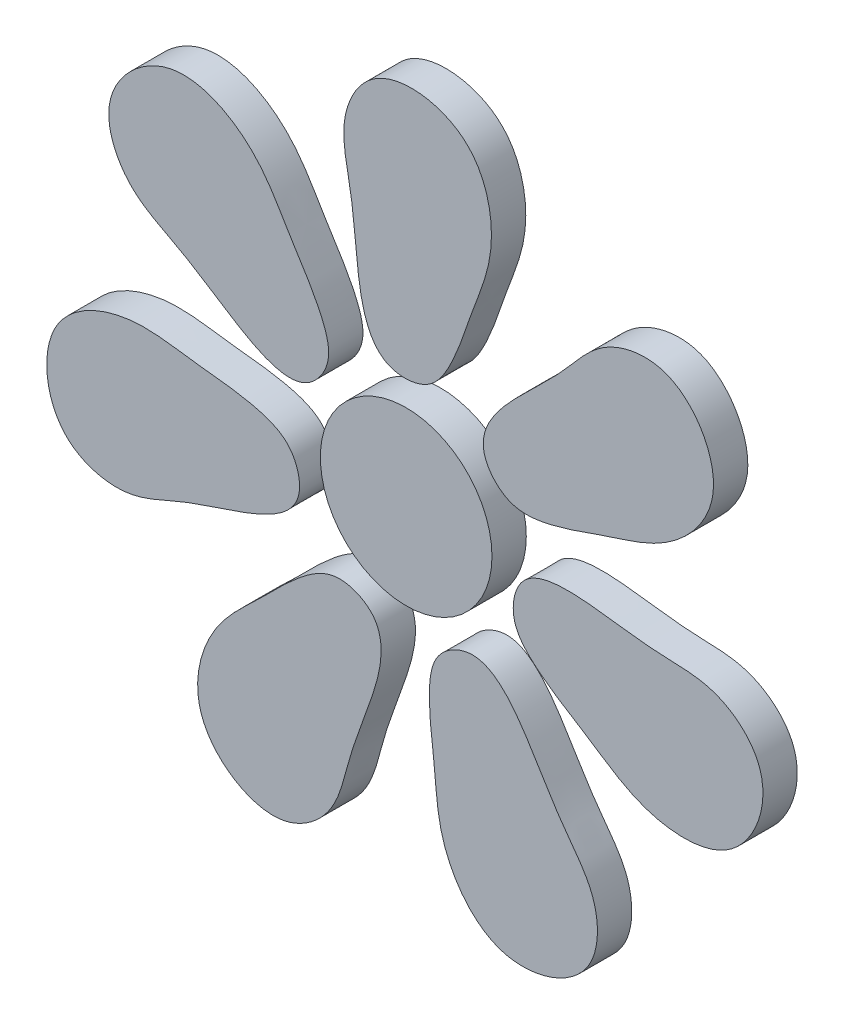
ISO-10303-21;
HEADER;
FILE_DESCRIPTION(('STEP AP214'),'2;1');
FILE_NAME('part.step','',(''),(''),'','','');
FILE_SCHEMA(('AUTOMOTIVE_DESIGN { 1 0 10303 214 1 1 1 1 }'));
ENDSEC;
DATA;
#1=APPLICATION_CONTEXT('core data for automotive mechanical design processes');
#2=APPLICATION_PROTOCOL_DEFINITION('international standard','automotive_design',2000,#1);
#3=PRODUCT_CONTEXT('',#1,'mechanical');
#4=PRODUCT('Part','Part','',(#3));
#5=PRODUCT_RELATED_PRODUCT_CATEGORY('part','',(#4));
#6=PRODUCT_DEFINITION_FORMATION('','',#4);
#7=PRODUCT_DEFINITION_CONTEXT('part definition',#1,'design');
#8=PRODUCT_DEFINITION('design','',#6,#7);
#9=PRODUCT_DEFINITION_SHAPE('','',#8);
#10=(LENGTH_UNIT() NAMED_UNIT(*) SI_UNIT(.MILLI.,.METRE.));
#11=(NAMED_UNIT(*) PLANE_ANGLE_UNIT() SI_UNIT($,.RADIAN.));
#12=(NAMED_UNIT(*) SI_UNIT($,.STERADIAN.) SOLID_ANGLE_UNIT());
#13=UNCERTAINTY_MEASURE_WITH_UNIT(LENGTH_MEASURE(1.E-05),#10,'distance_accuracy_value','');
#14=(GEOMETRIC_REPRESENTATION_CONTEXT(3) GLOBAL_UNCERTAINTY_ASSIGNED_CONTEXT((#13)) GLOBAL_UNIT_ASSIGNED_CONTEXT((#10,
#11,#12)) REPRESENTATION_CONTEXT('',''));
#15=CARTESIAN_POINT('',(0.,0.,0.));
#16=DIRECTION('',(0.,0.,1.));
#17=DIRECTION('',(1.,0.,0.));
#18=AXIS2_PLACEMENT_3D('',#15,#16,#17);
#19=CARTESIAN_POINT('',(-8.7157063745227,5.02927012028913,3.));
#20=CARTESIAN_POINT('',(-7.79480794176797,5.5258330694879,3.));
#21=CARTESIAN_POINT('',(-6.2833878442356,7.61822712008409,3.));
#22=CARTESIAN_POINT('',(-7.60543582917612,11.6263656182706,3.));
#23=CARTESIAN_POINT('',(-10.2531742253614,15.386270040157,3.));
#24=CARTESIAN_POINT('',(-13.1647376687376,20.885887549513,3.));
#25=CARTESIAN_POINT('',(-20.590599480846,24.84118901206,3.));
#26=CARTESIAN_POINT('',(-27.4268549689133,18.208794031494,3.));
#27=CARTESIAN_POINT('',(-24.5361890437206,11.8167667174271,3.));
#28=CARTESIAN_POINT('',(-19.5227764488252,9.61121625946348,3.));
#29=CARTESIAN_POINT('',(-15.2320361096864,6.55612792519539,3.));
#30=CARTESIAN_POINT('',(-10.5905530088203,4.01832326566444,3.));
#31=CARTESIAN_POINT('',(-8.7157063745227,5.02927012028913,3.));
#32=B_SPLINE_CURVE_WITH_KNOTS('',3,(#19,#20,#21,#22,#23,#24,#25,#26,#27,#28,#29,#30,#31),
.UNSPECIFIED.,.T.,.F.,(4,1,1,1,1,1,1,1,1,1,4),(0.,0.0586578101997314,0.114805371491496,
0.215050381526488,0.30976305051608,0.453162260181844,0.593196020306963,0.693192739936584,
0.777486537646103,0.8805792320666,1.),.UNSPECIFIED.);
#33=DIRECTION('',(0.,0.,-1.));
#34=VECTOR('',#33,1.);
#35=SURFACE_OF_LINEAR_EXTRUSION('',#32,#34);
#36=CARTESIAN_POINT('',(-8.7157063745227,5.02927012028913,3.));
#37=VERTEX_POINT('',#36);
#38=EDGE_CURVE('E11',#37,#37,#32,.T.);
#39=ORIENTED_EDGE('',*,*,#38,.F.);
#40=EDGE_LOOP('',(#39));
#41=FACE_BOUND('',#40,.T.);
#42=CARTESIAN_POINT('',(-8.7157063745227,5.02927012028913,0.));
#43=CARTESIAN_POINT('',(-7.79480794176797,5.5258330694879,0.));
#44=CARTESIAN_POINT('',(-6.2833878442356,7.61822712008409,0.));
#45=CARTESIAN_POINT('',(-7.60543582917612,11.6263656182706,0.));
#46=CARTESIAN_POINT('',(-10.2531742253614,15.386270040157,0.));
#47=CARTESIAN_POINT('',(-13.1647376687376,20.885887549513,0.));
#48=CARTESIAN_POINT('',(-20.590599480846,24.84118901206,0.));
#49=CARTESIAN_POINT('',(-27.4268549689133,18.208794031494,0.));
#50=CARTESIAN_POINT('',(-24.5361890437206,11.8167667174271,0.));
#51=CARTESIAN_POINT('',(-19.5227764488252,9.61121625946348,0.));
#52=CARTESIAN_POINT('',(-15.2320361096864,6.55612792519539,0.));
#53=CARTESIAN_POINT('',(-10.5905530088203,4.01832326566444,0.));
#54=CARTESIAN_POINT('',(-8.7157063745227,5.02927012028913,0.));
#55=B_SPLINE_CURVE_WITH_KNOTS('',3,(#42,#43,#44,#45,#46,#47,#48,#49,#50,#51,#52,#53,#54),
.UNSPECIFIED.,.T.,.F.,(4,1,1,1,1,1,1,1,1,1,4),(0.,0.0586578101997314,0.114805371491496,
0.215050381526488,0.30976305051608,0.453162260181844,0.593196020306963,0.693192739936584,
0.777486537646103,0.8805792320666,1.),.UNSPECIFIED.);
#56=CARTESIAN_POINT('',(-8.7157063745227,5.02927012028913,0.));
#57=VERTEX_POINT('',#56);
#58=EDGE_CURVE('E44',#57,#57,#55,.T.);
#59=ORIENTED_EDGE('',*,*,#58,.T.);
#60=EDGE_LOOP('',(#59));
#61=FACE_BOUND('',#60,.T.);
#62=ADVANCED_FACE('F40',(#41,#61),#35,.F.);
#63=CARTESIAN_POINT('',(-23.0372158571724,21.7789787478215,3.));
#64=DIRECTION('',(0.,0.,1.));
#65=DIRECTION('',(1.,0.,0.));
#66=AXIS2_PLACEMENT_3D('',#63,#64,#65);
#67=PLANE('',#66);
#68=ORIENTED_EDGE('',*,*,#38,.T.);
#69=EDGE_LOOP('',(#68));
#70=FACE_BOUND('',#69,.T.);
#71=ADVANCED_FACE('F63',(#70),#67,.T.);
#72=CARTESIAN_POINT('',(-23.0372158571724,21.7789787478215,0.));
#73=DIRECTION('',(0.,0.,1.));
#74=DIRECTION('',(1.,0.,0.));
#75=AXIS2_PLACEMENT_3D('',#72,#73,#74);
#76=PLANE('',#75);
#77=ORIENTED_EDGE('',*,*,#58,.F.);
#78=EDGE_LOOP('',(#77));
#79=FACE_BOUND('',#78,.T.);
#80=ADVANCED_FACE('F61',(#79),#76,.F.);
#81=CLOSED_SHELL('',(#62,#71,#80));
#82=MANIFOLD_SOLID_BREP('B2',#81);
#83=CARTESIAN_POINT('',(-9.36619575438787,-3.67851500475604,3.));
#84=CARTESIAN_POINT('',(-9.18025351972838,-2.6489256830666,3.));
#85=CARTESIAN_POINT('',(-9.87379804507752,-0.162663515564284,3.));
#86=CARTESIAN_POINT('',(-13.8317703452302,1.30275122653245,3.));
#87=CARTESIAN_POINT('',(-18.422219881343,1.57692805406512,3.));
#88=CARTESIAN_POINT('',(-24.5373241060997,2.72953152203774,3.));
#89=CARTESIAN_POINT('',(-32.2596524220326,-0.61015090195068,3.));
#90=CARTESIAN_POINT('',(-31.3365728017739,-10.0901812969986,3.));
#91=CARTESIAN_POINT('',(-24.5367838859027,-11.8155315149084,3.));
#92=CARTESIAN_POINT('',(-19.6866034762675,-9.27102593164264,3.));
#93=CARTESIAN_POINT('',(-14.622806390939,-7.82120647160211,3.));
#94=CARTESIAN_POINT('',(-9.74475343287397,-5.7746441823288,3.));
#95=CARTESIAN_POINT('',(-9.36619575438787,-3.67851500475604,3.));
#96=B_SPLINE_CURVE_WITH_KNOTS('',3,(#83,#84,#85,#86,#87,#88,#89,#90,#91,#92,#93,#94,#95),
.UNSPECIFIED.,.T.,.F.,(4,1,1,1,1,1,1,1,1,1,4),(0.,0.0586578101997314,0.114805371491496,
0.215050381526488,0.30976305051608,0.453162260181844,0.593196020306963,0.693192739936584,
0.777486537646104,0.8805792320666,1.),.UNSPECIFIED.);
#97=DIRECTION('',(0.,0.,-1.));
#98=VECTOR('',#97,1.);
#99=SURFACE_OF_LINEAR_EXTRUSION('',#96,#98);
#100=CARTESIAN_POINT('',(-9.36619575438787,-3.67851500475604,3.));
#101=VERTEX_POINT('',#100);
#102=EDGE_CURVE('E39',#101,#101,#96,.T.);
#103=ORIENTED_EDGE('',*,*,#102,.F.);
#104=EDGE_LOOP('',(#103));
#105=FACE_BOUND('',#104,.T.);
#106=CARTESIAN_POINT('',(-9.36619575438787,-3.67851500475604,0.));
#107=CARTESIAN_POINT('',(-9.18025351972838,-2.6489256830666,0.));
#108=CARTESIAN_POINT('',(-9.87379804507752,-0.162663515564284,0.));
#109=CARTESIAN_POINT('',(-13.8317703452302,1.30275122653245,0.));
#110=CARTESIAN_POINT('',(-18.422219881343,1.57692805406512,0.));
#111=CARTESIAN_POINT('',(-24.5373241060997,2.72953152203774,0.));
#112=CARTESIAN_POINT('',(-32.2596524220326,-0.61015090195068,0.));
#113=CARTESIAN_POINT('',(-31.3365728017739,-10.0901812969986,0.));
#114=CARTESIAN_POINT('',(-24.5367838859027,-11.8155315149084,0.));
#115=CARTESIAN_POINT('',(-19.6866034762675,-9.27102593164264,0.));
#116=CARTESIAN_POINT('',(-14.622806390939,-7.82120647160211,0.));
#117=CARTESIAN_POINT('',(-9.74475343287397,-5.7746441823288,0.));
#118=CARTESIAN_POINT('',(-9.36619575438787,-3.67851500475604,0.));
#119=B_SPLINE_CURVE_WITH_KNOTS('',3,(#106,#107,#108,#109,#110,#111,#112,#113,#114,#115,#116,
#117,#118),.UNSPECIFIED.,.T.,.F.,(4,1,1,1,1,1,1,1,1,1,4),(0.,0.0586578101997314,
0.114805371491496,0.215050381526488,0.30976305051608,0.453162260181844,0.593196020306963,
0.693192739936584,0.777486537646104,0.8805792320666,1.),.UNSPECIFIED.);
#120=CARTESIAN_POINT('',(-9.36619575438787,-3.67851500475604,0.));
#121=VERTEX_POINT('',#120);
#122=EDGE_CURVE('E104',#121,#121,#119,.T.);
#123=ORIENTED_EDGE('',*,*,#122,.T.);
#124=EDGE_LOOP('',(#123));
#125=FACE_BOUND('',#124,.T.);
#126=ADVANCED_FACE('F100',(#105,#125),#99,.F.);
#127=CARTESIAN_POINT('',(-31.3909603912143,-4.43224948138441,3.));
#128=DIRECTION('',(0.,0.,1.));
#129=DIRECTION('',(1.,0.,0.));
#130=AXIS2_PLACEMENT_3D('',#127,#128,#129);
#131=PLANE('',#130);
#132=ORIENTED_EDGE('',*,*,#102,.T.);
#133=EDGE_LOOP('',(#132));
#134=FACE_BOUND('',#133,.T.);
#135=ADVANCED_FACE('F123',(#134),#131,.T.);
#136=CARTESIAN_POINT('',(-31.3909603912143,-4.43224948138441,0.));
#137=DIRECTION('',(0.,0.,1.));
#138=DIRECTION('',(1.,0.,0.));
#139=AXIS2_PLACEMENT_3D('',#136,#137,#138);
#140=PLANE('',#139);
#141=ORIENTED_EDGE('',*,*,#122,.F.);
#142=EDGE_LOOP('',(#141));
#143=FACE_BOUND('',#142,.T.);
#144=ADVANCED_FACE('F121',(#143),#140,.F.);
#145=CLOSED_SHELL('',(#126,#135,#144));
#146=MANIFOLD_SOLID_BREP('B6',#145);
#147=CARTESIAN_POINT('',(-2.96374869562408,-9.61630330318856,3.));
#148=CARTESIAN_POINT('',(-3.65278095428877,-8.82898936803529,3.));
#149=CARTESIAN_POINT('',(-6.02903692920143,-7.82106520626173,3.));
#150=CARTESIAN_POINT('',(-9.64249967462995,-10.0018614100667,3.));
#151=CARTESIAN_POINT('',(-12.7189582218717,-13.4198729202079,3.));
#152=CARTESIAN_POINT('',(-17.4328050213736,-17.482217413828,3.));
#153=CARTESIAN_POINT('',(-19.6365291124433,-25.6020347419823,3.));
#154=CARTESIAN_POINT('',(-11.6492121653062,-30.7910443066626,3.));
#155=CARTESIAN_POINT('',(-6.06068000282338,-26.5504935235988,3.));
#156=CARTESIAN_POINT('',(-5.02601655255372,-21.1719965017575,3.));
#157=CARTESIAN_POINT('',(-3.0023052089239,-16.3090128717462,3.));
#158=CARTESIAN_POINT('',(-1.56095576522928,-11.2191867797541,3.));
#159=CARTESIAN_POINT('',(-2.96374869562408,-9.61630330318856,3.));
#160=B_SPLINE_CURVE_WITH_KNOTS('',3,(#147,#148,#149,#150,#151,#152,#153,#154,#155,#156,#157,
#158,#159),.UNSPECIFIED.,.T.,.F.,(4,1,1,1,1,1,1,1,1,1,4),(0.,0.0586578101997314,
0.114805371491496,0.215050381526488,0.30976305051608,0.453162260181844,0.593196020306963,
0.693192739936584,0.777486537646104,0.8805792320666,1.),.UNSPECIFIED.);
#161=DIRECTION('',(0.,0.,-1.));
#162=VECTOR('',#161,1.);
#163=SURFACE_OF_LINEAR_EXTRUSION('',#160,#162);
#164=CARTESIAN_POINT('',(-2.96374869562408,-9.61630330318856,3.));
#165=VERTEX_POINT('',#164);
#166=EDGE_CURVE('E99',#165,#165,#160,.T.);
#167=ORIENTED_EDGE('',*,*,#166,.F.);
#168=EDGE_LOOP('',(#167));
#169=FACE_BOUND('',#168,.T.);
#170=CARTESIAN_POINT('',(-2.96374869562408,-9.61630330318856,0.));
#171=CARTESIAN_POINT('',(-3.65278095428877,-8.82898936803529,0.));
#172=CARTESIAN_POINT('',(-6.02903692920143,-7.82106520626173,0.));
#173=CARTESIAN_POINT('',(-9.64249967462995,-10.0018614100667,0.));
#174=CARTESIAN_POINT('',(-12.7189582218717,-13.4198729202079,0.));
#175=CARTESIAN_POINT('',(-17.4328050213736,-17.482217413828,0.));
#176=CARTESIAN_POINT('',(-19.6365291124433,-25.6020347419823,0.));
#177=CARTESIAN_POINT('',(-11.6492121653062,-30.7910443066626,0.));
#178=CARTESIAN_POINT('',(-6.06068000282338,-26.5504935235988,0.));
#179=CARTESIAN_POINT('',(-5.02601655255372,-21.1719965017575,0.));
#180=CARTESIAN_POINT('',(-3.0023052089239,-16.3090128717462,0.));
#181=CARTESIAN_POINT('',(-1.56095576522928,-11.2191867797541,0.));
#182=CARTESIAN_POINT('',(-2.96374869562408,-9.61630330318856,0.));
#183=B_SPLINE_CURVE_WITH_KNOTS('',3,(#170,#171,#172,#173,#174,#175,#176,#177,#178,#179,#180,
#181,#182),.UNSPECIFIED.,.T.,.F.,(4,1,1,1,1,1,1,1,1,1,4),(0.,0.0586578101997314,
0.114805371491496,0.215050381526488,0.30976305051608,0.453162260181844,0.593196020306963,
0.693192739936584,0.777486537646104,0.8805792320666,1.),.UNSPECIFIED.);
#184=CARTESIAN_POINT('',(-2.96374869562408,-9.61630330318856,0.));
#185=VERTEX_POINT('',#184);
#186=EDGE_CURVE('E164',#185,#185,#183,.T.);
#187=ORIENTED_EDGE('',*,*,#186,.T.);
#188=EDGE_LOOP('',(#187));
#189=FACE_BOUND('',#188,.T.);
#190=ADVANCED_FACE('F160',(#169,#189),#163,.F.);
#191=CARTESIAN_POINT('',(-16.1066714917745,-27.3059034496951,3.));
#192=DIRECTION('',(0.,0.,1.));
#193=DIRECTION('',(1.,0.,0.));
#194=AXIS2_PLACEMENT_3D('',#191,#192,#193);
#195=PLANE('',#194);
#196=ORIENTED_EDGE('',*,*,#166,.T.);
#197=EDGE_LOOP('',(#196));
#198=FACE_BOUND('',#197,.T.);
#199=ADVANCED_FACE('F183',(#198),#195,.T.);
#200=CARTESIAN_POINT('',(-16.1066714917745,-27.3059034496951,0.));
#201=DIRECTION('',(0.,0.,1.));
#202=DIRECTION('',(1.,0.,0.));
#203=AXIS2_PLACEMENT_3D('',#200,#201,#202);
#204=PLANE('',#203);
#205=ORIENTED_EDGE('',*,*,#186,.F.);
#206=EDGE_LOOP('',(#205));
#207=FACE_BOUND('',#206,.T.);
#208=ADVANCED_FACE('F181',(#207),#204,.F.);
#209=CLOSED_SHELL('',(#190,#199,#208));
#210=MANIFOLD_SOLID_BREP('B34',#209);
#211=CARTESIAN_POINT('',(5.6704615804004,-8.31281907748097,3.));
#212=CARTESIAN_POINT('',(4.62531017288266,-8.36064398031176,3.));
#213=CARTESIAN_POINT('',(2.35571196430396,-9.59004527598841,3.));
#214=CARTESIAN_POINT('',(1.80776992211433,-13.7748684040944,3.));
#215=CARTESIAN_POINT('',(2.56193839813444,-18.3112358700447,3.));
#216=CARTESIAN_POINT('',(2.79897180886345,-24.5295000648355,3.));
#217=CARTESIAN_POINT('',(7.77330113101151,-31.3150642349672,3.));
#218=CARTESIAN_POINT('',(16.8102428322598,-28.3056229305705,3.));
#219=CARTESIAN_POINT('',(16.9792395377236,-21.2923923776519,3.));
#220=CARTESIAN_POINT('',(13.4192633472866,-17.1300218760265,3.));
#221=CARTESIAN_POINT('',(10.8789930312762,-12.515799936231,3.));
#222=CARTESIAN_POINT('',(7.79827343132787,-8.21545290232125,3.));
#223=CARTESIAN_POINT('',(5.6704615804004,-8.31281907748097,3.));
#224=B_SPLINE_CURVE_WITH_KNOTS('',3,(#211,#212,#213,#214,#215,#216,#217,#218,#219,#220,#221,
#222,#223),.UNSPECIFIED.,.T.,.F.,(4,1,1,1,1,1,1,1,1,1,4),(0.,0.0586578101997314,
0.114805371491496,0.215050381526488,0.30976305051608,0.453162260181844,0.593196020306963,
0.693192739936584,0.777486537646104,0.8805792320666,1.),.UNSPECIFIED.);
#225=DIRECTION('',(0.,0.,-1.));
#226=VECTOR('',#225,1.);
#227=SURFACE_OF_LINEAR_EXTRUSION('',#224,#226);
#228=CARTESIAN_POINT('',(5.6704615804004,-8.31281907748097,3.));
#229=VERTEX_POINT('',#228);
#230=EDGE_CURVE('E159',#229,#229,#224,.T.);
#231=ORIENTED_EDGE('',*,*,#230,.F.);
#232=EDGE_LOOP('',(#231));
#233=FACE_BOUND('',#232,.T.);
#234=CARTESIAN_POINT('',(5.6704615804004,-8.31281907748097,0.));
#235=CARTESIAN_POINT('',(4.62531017288266,-8.36064398031176,0.));
#236=CARTESIAN_POINT('',(2.35571196430396,-9.59004527598841,0.));
#237=CARTESIAN_POINT('',(1.80776992211433,-13.7748684040944,0.));
#238=CARTESIAN_POINT('',(2.56193839813444,-18.3112358700447,0.));
#239=CARTESIAN_POINT('',(2.79897180886345,-24.5295000648355,0.));
#240=CARTESIAN_POINT('',(7.77330113101151,-31.3150642349672,0.));
#241=CARTESIAN_POINT('',(16.8102428322598,-28.3056229305705,0.));
#242=CARTESIAN_POINT('',(16.9792395377236,-21.2923923776519,0.));
#243=CARTESIAN_POINT('',(13.4192633472866,-17.1300218760265,0.));
#244=CARTESIAN_POINT('',(10.8789930312762,-12.515799936231,0.));
#245=CARTESIAN_POINT('',(7.79827343132787,-8.21545290232125,0.));
#246=CARTESIAN_POINT('',(5.6704615804004,-8.31281907748097,0.));
#247=B_SPLINE_CURVE_WITH_KNOTS('',3,(#234,#235,#236,#237,#238,#239,#240,#241,#242,#243,#244,
#245,#246),.UNSPECIFIED.,.T.,.F.,(4,1,1,1,1,1,1,1,1,1,4),(0.,0.0586578101997314,
0.114805371491496,0.215050381526488,0.30976305051608,0.453162260181844,0.593196020306963,
0.693192739936584,0.777486537646104,0.8805792320666,1.),.UNSPECIFIED.);
#248=CARTESIAN_POINT('',(5.6704615804004,-8.31281907748097,0.));
#249=VERTEX_POINT('',#248);
#250=EDGE_CURVE('E224',#249,#249,#247,.T.);
#251=ORIENTED_EDGE('',*,*,#250,.T.);
#252=EDGE_LOOP('',(#251));
#253=FACE_BOUND('',#252,.T.);
#254=ADVANCED_FACE('F220',(#233,#253),#227,.F.);
#255=CARTESIAN_POINT('',(11.3062695571939,-29.6176551814638,3.));
#256=DIRECTION('',(0.,0.,1.));
#257=DIRECTION('',(1.,0.,0.));
#258=AXIS2_PLACEMENT_3D('',#255,#256,#257);
#259=PLANE('',#258);
#260=ORIENTED_EDGE('',*,*,#230,.T.);
#261=EDGE_LOOP('',(#260));
#262=FACE_BOUND('',#261,.T.);
#263=ADVANCED_FACE('F243',(#262),#259,.T.);
#264=CARTESIAN_POINT('',(11.3062695571939,-29.6176551814638,0.));
#265=DIRECTION('',(0.,0.,1.));
#266=DIRECTION('',(1.,0.,0.));
#267=AXIS2_PLACEMENT_3D('',#264,#265,#266);
#268=PLANE('',#267);
#269=ORIENTED_EDGE('',*,*,#250,.F.);
#270=EDGE_LOOP('',(#269));
#271=FACE_BOUND('',#270,.T.);
#272=ADVANCED_FACE('F241',(#271),#268,.F.);
#273=CLOSED_SHELL('',(#254,#263,#272));
#274=MANIFOLD_SOLID_BREP('B94',#273);
#275=CARTESIAN_POINT('',(10.0346986300469,-0.749612535823636,3.));
#276=CARTESIAN_POINT('',(9.42044840074035,-1.59656314935666,3.));
#277=CARTESIAN_POINT('',(8.96656170092167,-4.13752565162283,3.));
#278=CARTESIAN_POINT('',(11.8967518957204,-7.17511853373119,3.));
#279=CARTESIAN_POINT('',(15.9136431503259,-9.41386472859744,3.));
#280=CARTESIAN_POINT('',(20.9230657784065,-13.1055688564081,3.));
#281=CARTESIAN_POINT('',(29.3296770763686,-13.447211648124,3.));
#282=CARTESIAN_POINT('',(32.6112421106718,-4.50549015827611,3.));
#283=CARTESIAN_POINT('',(27.2334453929979,-0.000685485682339068,3.));
#284=CARTESIAN_POINT('',(21.7595642435335,-0.18879138888149,3.));
#285=CARTESIAN_POINT('',(16.5681876279097,0.702065627057804,3.));
#286=CARTESIAN_POINT('',(11.2852436783069,0.974684575258114,3.));
#287=CARTESIAN_POINT('',(10.0346986300469,-0.749612535823636,3.));
#288=B_SPLINE_CURVE_WITH_KNOTS('',3,(#275,#276,#277,#278,#279,#280,#281,#282,#283,#284,#285,
#286,#287),.UNSPECIFIED.,.T.,.F.,(4,1,1,1,1,1,1,1,1,1,4),(0.,0.0586578101997314,
0.114805371491496,0.215050381526488,0.30976305051608,0.453162260181844,0.593196020306963,
0.693192739936584,0.777486537646103,0.8805792320666,1.),.UNSPECIFIED.);
#289=DIRECTION('',(0.,0.,-1.));
#290=VECTOR('',#289,1.);
#291=SURFACE_OF_LINEAR_EXTRUSION('',#288,#290);
#292=CARTESIAN_POINT('',(10.0346986300469,-0.749612535823636,3.));
#293=VERTEX_POINT('',#292);
#294=EDGE_CURVE('E219',#293,#293,#288,.T.);
#295=ORIENTED_EDGE('',*,*,#294,.F.);
#296=EDGE_LOOP('',(#295));
#297=FACE_BOUND('',#296,.T.);
#298=CARTESIAN_POINT('',(10.0346986300469,-0.749612535823636,0.));
#299=CARTESIAN_POINT('',(9.42044840074035,-1.59656314935666,0.));
#300=CARTESIAN_POINT('',(8.96656170092167,-4.13752565162283,0.));
#301=CARTESIAN_POINT('',(11.8967518957204,-7.17511853373119,0.));
#302=CARTESIAN_POINT('',(15.9136431503259,-9.41386472859744,0.));
#303=CARTESIAN_POINT('',(20.9230657784065,-13.1055688564081,0.));
#304=CARTESIAN_POINT('',(29.3296770763686,-13.447211648124,0.));
#305=CARTESIAN_POINT('',(32.6112421106718,-4.50549015827611,0.));
#306=CARTESIAN_POINT('',(27.2334453929979,-0.000685485682339068,0.));
#307=CARTESIAN_POINT('',(21.7595642435335,-0.18879138888149,0.));
#308=CARTESIAN_POINT('',(16.5681876279097,0.702065627057804,0.));
#309=CARTESIAN_POINT('',(11.2852436783069,0.974684575258114,0.));
#310=CARTESIAN_POINT('',(10.0346986300469,-0.749612535823636,0.));
#311=B_SPLINE_CURVE_WITH_KNOTS('',3,(#298,#299,#300,#301,#302,#303,#304,#305,#306,#307,#308,
#309,#310),.UNSPECIFIED.,.T.,.F.,(4,1,1,1,1,1,1,1,1,1,4),(0.,0.0586578101997314,
0.114805371491496,0.215050381526488,0.30976305051608,0.453162260181844,0.593196020306963,
0.693192739936584,0.777486537646103,0.8805792320666,1.),.UNSPECIFIED.);
#312=CARTESIAN_POINT('',(10.0346986300469,-0.749612535823636,0.));
#313=VERTEX_POINT('',#312);
#314=EDGE_CURVE('E284',#313,#313,#311,.T.);
#315=ORIENTED_EDGE('',*,*,#314,.T.);
#316=EDGE_LOOP('',(#315));
#317=FACE_BOUND('',#316,.T.);
#318=ADVANCED_FACE('F280',(#297,#317),#291,.F.);
#319=CARTESIAN_POINT('',(30.205359023727,-9.62670847152703,3.));
#320=DIRECTION('',(0.,0.,1.));
#321=DIRECTION('',(1.,0.,0.));
#322=AXIS2_PLACEMENT_3D('',#319,#320,#321);
#323=PLANE('',#322);
#324=ORIENTED_EDGE('',*,*,#294,.T.);
#325=EDGE_LOOP('',(#324));
#326=FACE_BOUND('',#325,.T.);
#327=ADVANCED_FACE('F303',(#326),#323,.T.);
#328=CARTESIAN_POINT('',(30.205359023727,-9.62670847152703,0.));
#329=DIRECTION('',(0.,0.,1.));
#330=DIRECTION('',(1.,0.,0.));
#331=AXIS2_PLACEMENT_3D('',#328,#329,#330);
#332=PLANE('',#331);
#333=ORIENTED_EDGE('',*,*,#314,.F.);
#334=EDGE_LOOP('',(#333));
#335=FACE_BOUND('',#334,.T.);
#336=ADVANCED_FACE('F301',(#335),#332,.F.);
#337=CLOSED_SHELL('',(#318,#327,#336));
#338=MANIFOLD_SOLID_BREP('B154',#337);
#339=CARTESIAN_POINT('',(6.84260294071963,7.37806753461797,3.));
#340=CARTESIAN_POINT('',(7.12179684071336,6.36976229701708,3.));
#341=CARTESIAN_POINT('',(8.82540759221954,4.43063517855692,3.));
#342=CARTESIAN_POINT('',(13.0272370423361,4.82764193827649,3.));
#343=CARTESIAN_POINT('',(17.2820500311601,6.57233856132844,3.));
#344=CARTESIAN_POINT('',(23.2916644640483,8.18712300577979,3.));
#345=CARTESIAN_POINT('',(28.8002079668398,14.5466655828847,3.));
#346=CARTESIAN_POINT('',(23.85531093164,22.6873685984504,3.));
#347=CARTESIAN_POINT('',(16.9803114062981,21.2915375909874,3.));
#348=CARTESIAN_POINT('',(13.7144694501795,16.8946028647338,3.));
#349=CARTESIAN_POINT('',(9.78119901129126,13.3912614536432,3.));
#350=CARTESIAN_POINT('',(6.27419525850233,9.43086468772613,3.));
#351=CARTESIAN_POINT('',(6.84260294071963,7.37806753461797,3.));
#352=B_SPLINE_CURVE_WITH_KNOTS('',3,(#339,#340,#341,#342,#343,#344,#345,#346,#347,#348,#349,
#350,#351),.UNSPECIFIED.,.T.,.F.,(4,1,1,1,1,1,1,1,1,1,4),(0.,0.0586578101997314,
0.114805371491496,0.215050381526488,0.30976305051608,0.453162260181844,0.593196020306963,
0.693192739936584,0.777486537646104,0.8805792320666,1.),.UNSPECIFIED.);
#353=DIRECTION('',(0.,0.,-1.));
#354=VECTOR('',#353,1.);
#355=SURFACE_OF_LINEAR_EXTRUSION('',#352,#354);
#356=CARTESIAN_POINT('',(6.84260294071963,7.37806753461797,3.));
#357=VERTEX_POINT('',#356);
#358=EDGE_CURVE('E279',#357,#357,#352,.T.);
#359=ORIENTED_EDGE('',*,*,#358,.F.);
#360=EDGE_LOOP('',(#359));
#361=FACE_BOUND('',#360,.T.);
#362=CARTESIAN_POINT('',(6.84260294071963,7.37806753461797,0.));
#363=CARTESIAN_POINT('',(7.12179684071336,6.36976229701708,0.));
#364=CARTESIAN_POINT('',(8.82540759221954,4.43063517855692,0.));
#365=CARTESIAN_POINT('',(13.0272370423361,4.82764193827649,0.));
#366=CARTESIAN_POINT('',(17.2820500311601,6.57233856132844,0.));
#367=CARTESIAN_POINT('',(23.2916644640483,8.18712300577979,0.));
#368=CARTESIAN_POINT('',(28.8002079668398,14.5466655828847,0.));
#369=CARTESIAN_POINT('',(23.85531093164,22.6873685984504,0.));
#370=CARTESIAN_POINT('',(16.9803114062981,21.2915375909874,0.));
#371=CARTESIAN_POINT('',(13.7144694501795,16.8946028647338,0.));
#372=CARTESIAN_POINT('',(9.78119901129126,13.3912614536432,0.));
#373=CARTESIAN_POINT('',(6.27419525850233,9.43086468772613,0.));
#374=CARTESIAN_POINT('',(6.84260294071963,7.37806753461797,0.));
#375=B_SPLINE_CURVE_WITH_KNOTS('',3,(#362,#363,#364,#365,#366,#367,#368,#369,#370,#371,#372,
#373,#374),.UNSPECIFIED.,.T.,.F.,(4,1,1,1,1,1,1,1,1,1,4),(0.,0.0586578101997314,
0.114805371491496,0.215050381526488,0.30976305051608,0.453162260181844,0.593196020306963,
0.693192739936584,0.777486537646104,0.8805792320666,1.),.UNSPECIFIED.);
#376=CARTESIAN_POINT('',(6.84260294071963,7.37806753461797,0.));
#377=VERTEX_POINT('',#376);
#378=EDGE_CURVE('E344',#377,#377,#375,.T.);
#379=ORIENTED_EDGE('',*,*,#378,.T.);
#380=EDGE_LOOP('',(#379));
#381=FACE_BOUND('',#380,.T.);
#382=ADVANCED_FACE('F340',(#361,#381),#355,.F.);
#383=CARTESIAN_POINT('',(26.3591970683569,17.6133460665354,3.));
#384=DIRECTION('',(0.,0.,1.));
#385=DIRECTION('',(1.,0.,0.));
#386=AXIS2_PLACEMENT_3D('',#383,#384,#385);
#387=PLANE('',#386);
#388=ORIENTED_EDGE('',*,*,#358,.T.);
#389=EDGE_LOOP('',(#388));
#390=FACE_BOUND('',#389,.T.);
#391=ADVANCED_FACE('F363',(#390),#387,.T.);
#392=CARTESIAN_POINT('',(26.3591970683569,17.6133460665354,0.));
#393=DIRECTION('',(0.,0.,1.));
#394=DIRECTION('',(1.,0.,0.));
#395=AXIS2_PLACEMENT_3D('',#392,#393,#394);
#396=PLANE('',#395);
#397=ORIENTED_EDGE('',*,*,#378,.F.);
#398=EDGE_LOOP('',(#397));
#399=FACE_BOUND('',#398,.T.);
#400=ADVANCED_FACE('F361',(#399),#396,.F.);
#401=CLOSED_SHELL('',(#382,#391,#400));
#402=MANIFOLD_SOLID_BREP('B214',#401);
#403=CARTESIAN_POINT('',(-1.50211232663236,9.94991226634224,3.));
#404=CARTESIAN_POINT('',(-0.539712998551318,9.53952681426546,3.));
#405=CARTESIAN_POINT('',(2.03854156106934,9.6624373507964,3.));
#406=CARTESIAN_POINT('',(4.34794698886534,13.195089564813,3.));
#407=CARTESIAN_POINT('',(5.63672074895551,17.6094368632998,3.));
#408=CARTESIAN_POINT('',(8.12116474489259,23.3147442577415,3.));
#409=CARTESIAN_POINT('',(6.58359484110183,31.58660693208,3.));
#410=CARTESIAN_POINT('',(-2.86415593857843,32.7961760625638,3.));
#411=CARTESIAN_POINT('',(-6.05934340457316,26.5507985934273,3.));
#412=CARTESIAN_POINT('',(-4.65790056335344,21.2560165741112,3.));
#413=CARTESIAN_POINT('',(-4.37123196092807,15.9965642736832,3.));
#414=CARTESIAN_POINT('',(-3.46145016121372,10.7854113357556,3.));
#415=CARTESIAN_POINT('',(-1.50211232663236,9.94991226634224,3.));
#416=B_SPLINE_CURVE_WITH_KNOTS('',3,(#403,#404,#405,#406,#407,#408,#409,#410,#411,#412,#413,
#414,#415),.UNSPECIFIED.,.T.,.F.,(4,1,1,1,1,1,1,1,1,1,4),(0.,0.0586578101997314,
0.114805371491496,0.215050381526488,0.30976305051608,0.453162260181844,0.593196020306963,
0.693192739936584,0.777486537646103,0.8805792320666,1.),.UNSPECIFIED.);
#417=DIRECTION('',(0.,0.,-1.));
#418=VECTOR('',#417,1.);
#419=SURFACE_OF_LINEAR_EXTRUSION('',#416,#418);
#420=CARTESIAN_POINT('',(-1.50211232663236,9.94991226634224,3.));
#421=VERTEX_POINT('',#420);
#422=EDGE_CURVE('E339',#421,#421,#416,.T.);
#423=ORIENTED_EDGE('',*,*,#422,.F.);
#424=EDGE_LOOP('',(#423));
#425=FACE_BOUND('',#424,.T.);
#426=CARTESIAN_POINT('',(-1.50211232663236,9.94991226634224,0.));
#427=CARTESIAN_POINT('',(-0.539712998551318,9.53952681426546,0.));
#428=CARTESIAN_POINT('',(2.03854156106934,9.6624373507964,0.));
#429=CARTESIAN_POINT('',(4.34794698886534,13.195089564813,0.));
#430=CARTESIAN_POINT('',(5.63672074895551,17.6094368632998,0.));
#431=CARTESIAN_POINT('',(8.12116474489259,23.3147442577415,0.));
#432=CARTESIAN_POINT('',(6.58359484110183,31.58660693208,0.));
#433=CARTESIAN_POINT('',(-2.86415593857843,32.7961760625638,0.));
#434=CARTESIAN_POINT('',(-6.05934340457316,26.5507985934273,0.));
#435=CARTESIAN_POINT('',(-4.65790056335344,21.2560165741112,0.));
#436=CARTESIAN_POINT('',(-4.37123196092807,15.9965642736832,0.));
#437=CARTESIAN_POINT('',(-3.46145016121372,10.7854113357556,0.));
#438=CARTESIAN_POINT('',(-1.50211232663236,9.94991226634224,0.));
#439=B_SPLINE_CURVE_WITH_KNOTS('',3,(#426,#427,#428,#429,#430,#431,#432,#433,#434,#435,#436,
#437,#438),.UNSPECIFIED.,.T.,.F.,(4,1,1,1,1,1,1,1,1,1,4),(0.,0.0586578101997314,
0.114805371491496,0.215050381526488,0.30976305051608,0.453162260181844,0.593196020306963,
0.693192739936584,0.777486537646103,0.8805792320666,1.),.UNSPECIFIED.);
#440=CARTESIAN_POINT('',(-1.50211232663236,9.94991226634224,0.));
#441=VERTEX_POINT('',#440);
#442=EDGE_CURVE('E403',#441,#441,#439,.T.);
#443=ORIENTED_EDGE('',*,*,#442,.T.);
#444=EDGE_LOOP('',(#443));
#445=FACE_BOUND('',#444,.T.);
#446=ADVANCED_FACE('F399',(#425,#445),#419,.F.);
#447=CARTESIAN_POINT('',(2.66402209088328,31.5901917697139,3.));
#448=DIRECTION('',(0.,0.,1.));
#449=DIRECTION('',(1.,0.,0.));
#450=AXIS2_PLACEMENT_3D('',#447,#448,#449);
#451=PLANE('',#450);
#452=ORIENTED_EDGE('',*,*,#422,.T.);
#453=EDGE_LOOP('',(#452));
#454=FACE_BOUND('',#453,.T.);
#455=ADVANCED_FACE('F422',(#454),#451,.T.);
#456=CARTESIAN_POINT('',(2.66402209088328,31.5901917697139,0.));
#457=DIRECTION('',(0.,0.,1.));
#458=DIRECTION('',(1.,0.,0.));
#459=AXIS2_PLACEMENT_3D('',#456,#457,#458);
#460=PLANE('',#459);
#461=ORIENTED_EDGE('',*,*,#442,.F.);
#462=EDGE_LOOP('',(#461));
#463=FACE_BOUND('',#462,.T.);
#464=ADVANCED_FACE('F420',(#463),#460,.F.);
#465=CLOSED_SHELL('',(#446,#455,#464));
#466=MANIFOLD_SOLID_BREP('B274',#465);
#467=CARTESIAN_POINT('',(0.,0.,3.));
#468=DIRECTION('',(0.,0.,-1.));
#469=DIRECTION('',(-1.,0.,0.));
#470=AXIS2_PLACEMENT_3D('',#467,#468,#469);
#471=CYLINDRICAL_SURFACE('',#470,7.5);
#472=CARTESIAN_POINT('',(0.,0.,3.));
#473=DIRECTION('',(0.,0.,1.));
#474=DIRECTION('',(1.,0.,0.));
#475=AXIS2_PLACEMENT_3D('',#472,#473,#474);
#476=CIRCLE('',#475,7.5);
#477=CARTESIAN_POINT('',(7.5,0.,3.));
#478=VERTEX_POINT('',#477);
#479=EDGE_CURVE('E398',#478,#478,#476,.T.);
#480=ORIENTED_EDGE('',*,*,#479,.F.);
#481=EDGE_LOOP('',(#480));
#482=FACE_BOUND('',#481,.T.);
#483=CARTESIAN_POINT('',(0.,0.,0.));
#484=DIRECTION('',(0.,0.,1.));
#485=DIRECTION('',(1.,0.,0.));
#486=AXIS2_PLACEMENT_3D('',#483,#484,#485);
#487=CIRCLE('',#486,7.5);
#488=CARTESIAN_POINT('',(7.5,0.,0.));
#489=VERTEX_POINT('',#488);
#490=EDGE_CURVE('E454',#489,#489,#487,.T.);
#491=ORIENTED_EDGE('',*,*,#490,.T.);
#492=EDGE_LOOP('',(#491));
#493=FACE_BOUND('',#492,.T.);
#494=ADVANCED_FACE('F451',(#482,#493),#471,.T.);
#495=CARTESIAN_POINT('',(0.,0.,3.));
#496=DIRECTION('',(0.,0.,1.));
#497=DIRECTION('',(1.,0.,0.));
#498=AXIS2_PLACEMENT_3D('',#495,#496,#497);
#499=PLANE('',#498);
#500=ORIENTED_EDGE('',*,*,#479,.T.);
#501=EDGE_LOOP('',(#500));
#502=FACE_BOUND('',#501,.T.);
#503=ADVANCED_FACE('F466',(#502),#499,.T.);
#504=CARTESIAN_POINT('',(0.,0.,0.));
#505=DIRECTION('',(0.,0.,1.));
#506=DIRECTION('',(1.,0.,0.));
#507=AXIS2_PLACEMENT_3D('',#504,#505,#506);
#508=PLANE('',#507);
#509=ORIENTED_EDGE('',*,*,#490,.F.);
#510=EDGE_LOOP('',(#509));
#511=FACE_BOUND('',#510,.T.);
#512=ADVANCED_FACE('F464',(#511),#508,.F.);
#513=CLOSED_SHELL('',(#494,#503,#512));
#514=MANIFOLD_SOLID_BREP('B334',#513);
#515=ADVANCED_BREP_SHAPE_REPRESENTATION('',(#18,#82,#146,#210,#274,#338,#402,#466,#514),#14);
#516=SHAPE_DEFINITION_REPRESENTATION(#9,#515);
ENDSEC;
END-ISO-10303-21;
